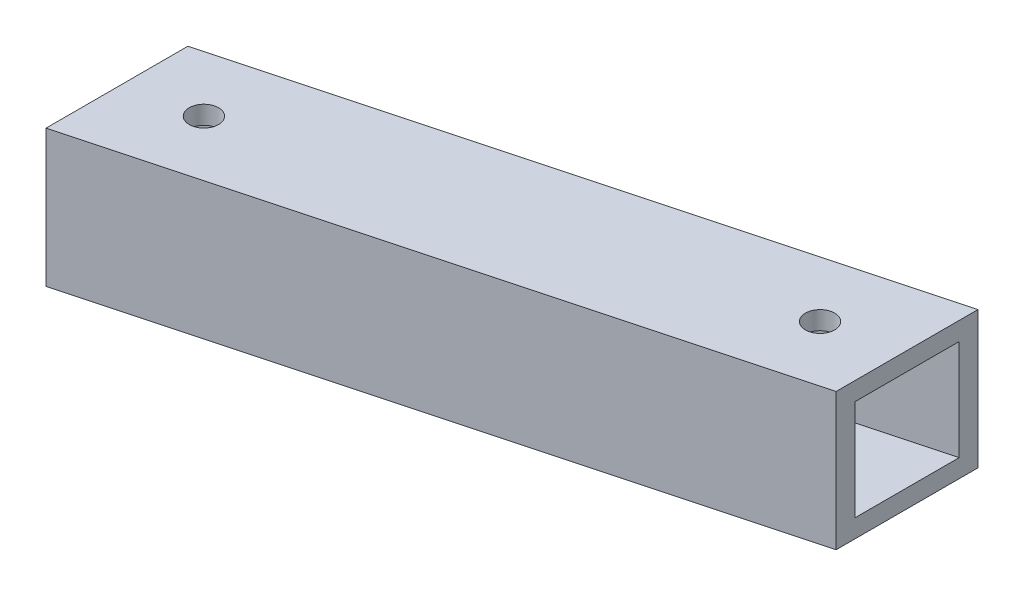
ISO-10303-21;
HEADER;
FILE_DESCRIPTION(('STEP AP214'),'2;1');
FILE_NAME('part.step','',(''),(''),'','','');
FILE_SCHEMA(('AUTOMOTIVE_DESIGN { 1 0 10303 214 1 1 1 1 }'));
ENDSEC;
DATA;
#1=APPLICATION_CONTEXT('core data for automotive mechanical design processes');
#2=APPLICATION_PROTOCOL_DEFINITION('international standard','automotive_design',2000,#1);
#3=PRODUCT_CONTEXT('',#1,'mechanical');
#4=PRODUCT('Part','Part','',(#3));
#5=PRODUCT_RELATED_PRODUCT_CATEGORY('part','',(#4));
#6=PRODUCT_DEFINITION_FORMATION('','',#4);
#7=PRODUCT_DEFINITION_CONTEXT('part definition',#1,'design');
#8=PRODUCT_DEFINITION('design','',#6,#7);
#9=PRODUCT_DEFINITION_SHAPE('','',#8);
#10=(LENGTH_UNIT() NAMED_UNIT(*) SI_UNIT(.MILLI.,.METRE.));
#11=(NAMED_UNIT(*) PLANE_ANGLE_UNIT() SI_UNIT($,.RADIAN.));
#12=(NAMED_UNIT(*) SI_UNIT($,.STERADIAN.) SOLID_ANGLE_UNIT());
#13=UNCERTAINTY_MEASURE_WITH_UNIT(LENGTH_MEASURE(1.E-05),#10,'distance_accuracy_value','');
#14=(GEOMETRIC_REPRESENTATION_CONTEXT(3) GLOBAL_UNCERTAINTY_ASSIGNED_CONTEXT((#13)) GLOBAL_UNIT_ASSIGNED_CONTEXT((#10,
#11,#12)) REPRESENTATION_CONTEXT('',''));
#15=CARTESIAN_POINT('',(0.,0.,0.));
#16=DIRECTION('',(0.,0.,1.));
#17=DIRECTION('',(1.,0.,0.));
#18=AXIS2_PLACEMENT_3D('',#15,#16,#17);
#19=CARTESIAN_POINT('',(130.257574262251,13.,-32.8318594707867));
#20=DIRECTION('',(0.,-1.,0.));
#21=DIRECTION('',(0.,0.,-1.));
#22=AXIS2_PLACEMENT_3D('',#19,#20,#21);
#23=PLANE('',#22);
#24=CARTESIAN_POINT('',(118.617714323462,13.,-24.0189494079213));
#25=DIRECTION('',(0.,-1.,0.));
#26=DIRECTION('',(0.,0.,-1.));
#27=AXIS2_PLACEMENT_3D('',#24,#25,#26);
#28=CIRCLE('',#27,1.6);
#29=CARTESIAN_POINT('',(118.617714323462,13.,-25.6189494079213));
#30=VERTEX_POINT('',#29);
#31=EDGE_CURVE('E182',#30,#30,#28,.T.);
#32=ORIENTED_EDGE('',*,*,#31,.F.);
#33=EDGE_LOOP('',(#32));
#34=FACE_BOUND('',#33,.T.);
#35=CARTESIAN_POINT('',(65.4555495773448,13.,-9.77419029630902));
#36=DIRECTION('',(0.,-1.,0.));
#37=DIRECTION('',(0.,0.,-1.));
#38=AXIS2_PLACEMENT_3D('',#35,#36,#37);
#39=CIRCLE('',#38,1.6);
#40=CARTESIAN_POINT('',(65.4555495773448,13.,-11.374190296309));
#41=VERTEX_POINT('',#40);
#42=EDGE_CURVE('E259',#41,#41,#39,.T.);
#43=ORIENTED_EDGE('',*,*,#42,.F.);
#44=EDGE_LOOP('',(#43));
#45=FACE_BOUND('',#44,.T.);
#46=DIRECTION('',(0.,0.,-1.));
#47=VECTOR('',#46,1.);
#48=CARTESIAN_POINT('',(126.117714323462,13.,-32.8318594707867));
#49=LINE('',#48,#47);
#50=CARTESIAN_POINT('',(126.117714323462,13.,-20.3345493588993));
#51=VERTEX_POINT('',#50);
#52=CARTESIAN_POINT('',(126.117714323462,13.,-31.7225873434102));
#53=VERTEX_POINT('',#52);
#54=EDGE_CURVE('E11',#51,#53,#49,.T.);
#55=ORIENTED_EDGE('',*,*,#54,.F.);
#56=DIRECTION('',(-0.965925826289069,0.,0.258819045102518));
#57=VECTOR('',#56,1.);
#58=CARTESIAN_POINT('',(133.104583758379,13.,-22.2066753816069));
#59=LINE('',#58,#57);
#60=CARTESIAN_POINT('',(57.9555495773448,13.,-2.07055236082013));
#61=VERTEX_POINT('',#60);
#62=EDGE_CURVE('E155',#51,#61,#59,.T.);
#63=ORIENTED_EDGE('',*,*,#62,.T.);
#64=DIRECTION('',(0.,0.,1.));
#65=VECTOR('',#64,1.);
#66=CARTESIAN_POINT('',(57.9555495773448,13.,-32.8318594707867));
#67=LINE('',#66,#65);
#68=CARTESIAN_POINT('',(57.9555495773448,13.,-13.4585903453311));
#69=VERTEX_POINT('',#68);
#70=EDGE_CURVE('E53',#69,#61,#67,.T.);
#71=ORIENTED_EDGE('',*,*,#70,.F.);
#72=DIRECTION('',(-0.965925826289069,0.,0.258819045102518));
#73=VECTOR('',#72,1.);
#74=CARTESIAN_POINT('',(130.257574262251,13.,-32.8318594707867));
#75=LINE('',#74,#73);
#76=EDGE_CURVE('E161',#53,#69,#75,.T.);
#77=ORIENTED_EDGE('',*,*,#76,.F.);
#78=EDGE_LOOP('',(#55,#63,#71,#77));
#79=FACE_BOUND('',#78,.T.);
#80=ADVANCED_FACE('F45',(#34,#45,#79),#23,.T.);
#81=CARTESIAN_POINT('',(130.257574262251,2.,-32.8318594707867));
#82=DIRECTION('',(0.258819045102518,0.,0.965925826289069));
#83=DIRECTION('',(0.965925826289069,0.,-0.258819045102518));
#84=AXIS2_PLACEMENT_3D('',#81,#82,#83);
#85=PLANE('',#84);
#86=DIRECTION('',(0.,-1.,0.));
#87=VECTOR('',#86,1.);
#88=CARTESIAN_POINT('',(126.117714323462,2.,-31.7225873434102));
#89=LINE('',#88,#87);
#90=CARTESIAN_POINT('',(126.117714323462,2.,-31.7225873434102));
#91=VERTEX_POINT('',#90);
#92=EDGE_CURVE('E157',#53,#91,#89,.T.);
#93=ORIENTED_EDGE('',*,*,#92,.F.);
#94=ORIENTED_EDGE('',*,*,#76,.T.);
#95=DIRECTION('',(0.,1.,0.));
#96=VECTOR('',#95,1.);
#97=CARTESIAN_POINT('',(57.9555495773448,2.,-13.4585903453311));
#98=LINE('',#97,#96);
#99=CARTESIAN_POINT('',(57.9555495773448,2.,-13.4585903453311));
#100=VERTEX_POINT('',#99);
#101=EDGE_CURVE('E145',#100,#69,#98,.T.);
#102=ORIENTED_EDGE('',*,*,#101,.F.);
#103=DIRECTION('',(-0.965925826289069,0.,0.258819045102518));
#104=VECTOR('',#103,1.);
#105=CARTESIAN_POINT('',(130.257574262251,2.,-32.8318594707867));
#106=LINE('',#105,#104);
#107=EDGE_CURVE('E164',#91,#100,#106,.T.);
#108=ORIENTED_EDGE('',*,*,#107,.F.);
#109=EDGE_LOOP('',(#93,#94,#102,#108));
#110=FACE_BOUND('',#109,.T.);
#111=ADVANCED_FACE('F194',(#110),#85,.T.);
#112=CARTESIAN_POINT('',(133.104583758379,2.,-22.2066753816069));
#113=DIRECTION('',(0.,1.,0.));
#114=DIRECTION('',(0.,0.,1.));
#115=AXIS2_PLACEMENT_3D('',#112,#113,#114);
#116=PLANE('',#115);
#117=CARTESIAN_POINT('',(118.617714323462,2.,-24.0189494079213));
#118=DIRECTION('',(0.,1.,0.));
#119=DIRECTION('',(0.,0.,1.));
#120=AXIS2_PLACEMENT_3D('',#117,#118,#119);
#121=CIRCLE('',#120,1.6);
#122=CARTESIAN_POINT('',(118.617714323462,2.,-22.4189494079213));
#123=VERTEX_POINT('',#122);
#124=EDGE_CURVE('E272',#123,#123,#121,.T.);
#125=ORIENTED_EDGE('',*,*,#124,.F.);
#126=EDGE_LOOP('',(#125));
#127=FACE_BOUND('',#126,.T.);
#128=CARTESIAN_POINT('',(65.4555495773448,2.,-9.77419029630902));
#129=DIRECTION('',(0.,1.,0.));
#130=DIRECTION('',(0.,0.,1.));
#131=AXIS2_PLACEMENT_3D('',#128,#129,#130);
#132=CIRCLE('',#131,1.6);
#133=CARTESIAN_POINT('',(65.4555495773448,2.,-8.17419029630901));
#134=VERTEX_POINT('',#133);
#135=EDGE_CURVE('E255',#134,#134,#132,.T.);
#136=ORIENTED_EDGE('',*,*,#135,.F.);
#137=EDGE_LOOP('',(#136));
#138=FACE_BOUND('',#137,.T.);
#139=DIRECTION('',(0.,0.,1.));
#140=VECTOR('',#139,1.);
#141=CARTESIAN_POINT('',(126.117714323462,2.,-22.2066753816069));
#142=LINE('',#141,#140);
#143=CARTESIAN_POINT('',(126.117714323462,2.,-20.3345493588993));
#144=VERTEX_POINT('',#143);
#145=EDGE_CURVE('E166',#91,#144,#142,.T.);
#146=ORIENTED_EDGE('',*,*,#145,.F.);
#147=ORIENTED_EDGE('',*,*,#107,.T.);
#148=DIRECTION('',(0.,0.,-1.));
#149=VECTOR('',#148,1.);
#150=CARTESIAN_POINT('',(57.9555495773448,2.,-22.2066753816069));
#151=LINE('',#150,#149);
#152=CARTESIAN_POINT('',(57.9555495773448,2.,-2.07055236082013));
#153=VERTEX_POINT('',#152);
#154=EDGE_CURVE('E158',#153,#100,#151,.T.);
#155=ORIENTED_EDGE('',*,*,#154,.F.);
#156=DIRECTION('',(-0.965925826289069,0.,0.258819045102518));
#157=VECTOR('',#156,1.);
#158=CARTESIAN_POINT('',(133.104583758379,2.,-22.2066753816069));
#159=LINE('',#158,#157);
#160=EDGE_CURVE('E133',#144,#153,#159,.T.);
#161=ORIENTED_EDGE('',*,*,#160,.F.);
#162=EDGE_LOOP('',(#146,#147,#155,#161));
#163=FACE_BOUND('',#162,.T.);
#164=ADVANCED_FACE('F192',(#127,#138,#163),#116,.T.);
#165=CARTESIAN_POINT('',(133.104583758379,13.,-22.2066753816069));
#166=DIRECTION('',(-0.258819045102518,0.,-0.965925826289069));
#167=DIRECTION('',(-0.965925826289069,0.,0.258819045102518));
#168=AXIS2_PLACEMENT_3D('',#165,#166,#167);
#169=PLANE('',#168);
#170=DIRECTION('',(0.,1.,0.));
#171=VECTOR('',#170,1.);
#172=CARTESIAN_POINT('',(126.117714323462,13.,-20.3345493588993));
#173=LINE('',#172,#171);
#174=EDGE_CURVE('E162',#144,#51,#173,.T.);
#175=ORIENTED_EDGE('',*,*,#174,.F.);
#176=ORIENTED_EDGE('',*,*,#160,.T.);
#177=DIRECTION('',(0.,-1.,0.));
#178=VECTOR('',#177,1.);
#179=CARTESIAN_POINT('',(57.9555495773448,13.,-2.07055236082013));
#180=LINE('',#179,#178);
#181=EDGE_CURVE('E142',#61,#153,#180,.T.);
#182=ORIENTED_EDGE('',*,*,#181,.F.);
#183=ORIENTED_EDGE('',*,*,#62,.F.);
#184=EDGE_LOOP('',(#175,#176,#182,#183));
#185=FACE_BOUND('',#184,.T.);
#186=ADVANCED_FACE('F154',(#185),#169,.T.);
#187=CARTESIAN_POINT('',(57.9555495773448,0.,-15.5291427061512));
#188=DIRECTION('',(1.,0.,0.));
#189=DIRECTION('',(0.,0.,-1.));
#190=AXIS2_PLACEMENT_3D('',#187,#188,#189);
#191=PLANE('',#190);
#192=ORIENTED_EDGE('',*,*,#181,.T.);
#193=ORIENTED_EDGE('',*,*,#154,.T.);
#194=ORIENTED_EDGE('',*,*,#101,.T.);
#195=ORIENTED_EDGE('',*,*,#70,.T.);
#196=EDGE_LOOP('',(#192,#193,#194,#195));
#197=FACE_BOUND('',#196,.T.);
#198=DIRECTION('',(0.,0.,-1.));
#199=VECTOR('',#198,1.);
#200=CARTESIAN_POINT('',(57.9555495773448,15.,-15.5291427061512));
#201=LINE('',#200,#199);
#202=CARTESIAN_POINT('',(57.9555495773448,15.,0.));
#203=VERTEX_POINT('',#202);
#204=CARTESIAN_POINT('',(57.9555495773448,15.,-15.5291427061512));
#205=VERTEX_POINT('',#204);
#206=EDGE_CURVE('E176',#203,#205,#201,.T.);
#207=ORIENTED_EDGE('',*,*,#206,.T.);
#208=DIRECTION('',(0.,1.,0.));
#209=VECTOR('',#208,1.);
#210=CARTESIAN_POINT('',(57.9555495773448,0.,-15.5291427061512));
#211=LINE('',#210,#209);
#212=CARTESIAN_POINT('',(57.9555495773448,0.,-15.5291427061512));
#213=VERTEX_POINT('',#212);
#214=EDGE_CURVE('E60',#213,#205,#211,.T.);
#215=ORIENTED_EDGE('',*,*,#214,.F.);
#216=DIRECTION('',(0.,0.,-1.));
#217=VECTOR('',#216,1.);
#218=CARTESIAN_POINT('',(57.9555495773448,0.,-15.5291427061512));
#219=LINE('',#218,#217);
#220=CARTESIAN_POINT('',(57.9555495773448,0.,0.));
#221=VERTEX_POINT('',#220);
#222=EDGE_CURVE('E127',#221,#213,#219,.T.);
#223=ORIENTED_EDGE('',*,*,#222,.F.);
#224=DIRECTION('',(0.,-1.,0.));
#225=VECTOR('',#224,1.);
#226=CARTESIAN_POINT('',(57.9555495773448,15.,0.));
#227=LINE('',#226,#225);
#228=EDGE_CURVE('E124',#203,#221,#227,.T.);
#229=ORIENTED_EDGE('',*,*,#228,.F.);
#230=EDGE_LOOP('',(#207,#215,#223,#229));
#231=FACE_BOUND('',#230,.T.);
#232=ADVANCED_FACE('F141',(#197,#231),#191,.F.);
#233=CARTESIAN_POINT('',(126.117714323462,0.,-33.7931397042304));
#234=DIRECTION('',(-1.,0.,0.));
#235=DIRECTION('',(0.,0.,1.));
#236=AXIS2_PLACEMENT_3D('',#233,#234,#235);
#237=PLANE('',#236);
#238=ORIENTED_EDGE('',*,*,#174,.T.);
#239=ORIENTED_EDGE('',*,*,#54,.T.);
#240=ORIENTED_EDGE('',*,*,#92,.T.);
#241=ORIENTED_EDGE('',*,*,#145,.T.);
#242=EDGE_LOOP('',(#238,#239,#240,#241));
#243=FACE_BOUND('',#242,.T.);
#244=DIRECTION('',(0.,0.,1.));
#245=VECTOR('',#244,1.);
#246=CARTESIAN_POINT('',(126.117714323462,15.,-33.7931397042304));
#247=LINE('',#246,#245);
#248=CARTESIAN_POINT('',(126.117714323462,15.,-33.7931397042304));
#249=VERTEX_POINT('',#248);
#250=CARTESIAN_POINT('',(126.117714323462,15.,-18.2639969980791));
#251=VERTEX_POINT('',#250);
#252=EDGE_CURVE('E115',#249,#251,#247,.T.);
#253=ORIENTED_EDGE('',*,*,#252,.T.);
#254=DIRECTION('',(0.,1.,0.));
#255=VECTOR('',#254,1.);
#256=CARTESIAN_POINT('',(126.117714323462,0.,-18.2639969980791));
#257=LINE('',#256,#255);
#258=CARTESIAN_POINT('',(126.117714323462,0.,-18.2639969980791));
#259=VERTEX_POINT('',#258);
#260=EDGE_CURVE('E68',#259,#251,#257,.T.);
#261=ORIENTED_EDGE('',*,*,#260,.F.);
#262=DIRECTION('',(0.,0.,1.));
#263=VECTOR('',#262,1.);
#264=CARTESIAN_POINT('',(126.117714323462,0.,-33.7931397042304));
#265=LINE('',#264,#263);
#266=CARTESIAN_POINT('',(126.117714323462,0.,-33.7931397042304));
#267=VERTEX_POINT('',#266);
#268=EDGE_CURVE('E106',#267,#259,#265,.T.);
#269=ORIENTED_EDGE('',*,*,#268,.F.);
#270=DIRECTION('',(0.,-1.,0.));
#271=VECTOR('',#270,1.);
#272=CARTESIAN_POINT('',(126.117714323462,15.,-33.7931397042304));
#273=LINE('',#272,#271);
#274=EDGE_CURVE('E109',#249,#267,#273,.T.);
#275=ORIENTED_EDGE('',*,*,#274,.F.);
#276=EDGE_LOOP('',(#253,#261,#269,#275));
#277=FACE_BOUND('',#276,.T.);
#278=ADVANCED_FACE('F108',(#243,#277),#237,.F.);
#279=CARTESIAN_POINT('',(3.88228567653777,15.,14.488887394336));
#280=DIRECTION('',(0.258819045102518,0.,0.965925826289069));
#281=DIRECTION('',(0.965925826289069,0.,-0.258819045102518));
#282=AXIS2_PLACEMENT_3D('',#279,#280,#281);
#283=PLANE('',#282);
#284=ORIENTED_EDGE('',*,*,#260,.T.);
#285=DIRECTION('',(-0.965925826289069,0.,0.258819045102518));
#286=VECTOR('',#285,1.);
#287=CARTESIAN_POINT('',(3.88228567653777,15.,14.488887394336));
#288=LINE('',#287,#286);
#289=EDGE_CURVE('E128',#251,#203,#288,.T.);
#290=ORIENTED_EDGE('',*,*,#289,.T.);
#291=ORIENTED_EDGE('',*,*,#228,.T.);
#292=DIRECTION('',(-0.965925826289069,0.,0.258819045102518));
#293=VECTOR('',#292,1.);
#294=CARTESIAN_POINT('',(3.88228567653777,0.,14.488887394336));
#295=LINE('',#294,#293);
#296=EDGE_CURVE('E129',#259,#221,#295,.T.);
#297=ORIENTED_EDGE('',*,*,#296,.F.);
#298=EDGE_LOOP('',(#284,#290,#291,#297));
#299=FACE_BOUND('',#298,.T.);
#300=ADVANCED_FACE('F47',(#299),#283,.T.);
#301=CARTESIAN_POINT('',(0.,15.,0.));
#302=DIRECTION('',(0.258819045102518,0.,0.965925826289069));
#303=DIRECTION('',(0.965925826289069,0.,-0.258819045102518));
#304=AXIS2_PLACEMENT_3D('',#301,#302,#303);
#305=PLANE('',#304);
#306=DIRECTION('',(-0.965925826289069,0.,0.258819045102518));
#307=VECTOR('',#306,1.);
#308=CARTESIAN_POINT('',(0.,0.,0.));
#309=LINE('',#308,#307);
#310=EDGE_CURVE('E121',#267,#213,#309,.T.);
#311=ORIENTED_EDGE('',*,*,#310,.T.);
#312=ORIENTED_EDGE('',*,*,#214,.T.);
#313=DIRECTION('',(-0.965925826289069,0.,0.258819045102518));
#314=VECTOR('',#313,1.);
#315=CARTESIAN_POINT('',(0.,15.,0.));
#316=LINE('',#315,#314);
#317=EDGE_CURVE('E123',#249,#205,#316,.T.);
#318=ORIENTED_EDGE('',*,*,#317,.F.);
#319=ORIENTED_EDGE('',*,*,#274,.T.);
#320=EDGE_LOOP('',(#311,#312,#318,#319));
#321=FACE_BOUND('',#320,.T.);
#322=ADVANCED_FACE('F120',(#321),#305,.F.);
#323=CARTESIAN_POINT('',(0.,15.,0.));
#324=DIRECTION('',(0.,1.,0.));
#325=DIRECTION('',(0.,0.,1.));
#326=AXIS2_PLACEMENT_3D('',#323,#324,#325);
#327=PLANE('',#326);
#328=CARTESIAN_POINT('',(118.617714323462,15.,-24.0189494079213));
#329=DIRECTION('',(0.,-1.,0.));
#330=DIRECTION('',(0.,0.,-1.));
#331=AXIS2_PLACEMENT_3D('',#328,#329,#330);
#332=CIRCLE('',#331,1.6);
#333=CARTESIAN_POINT('',(118.617714323462,15.,-25.6189494079213));
#334=VERTEX_POINT('',#333);
#335=EDGE_CURVE('E254',#334,#334,#332,.T.);
#336=ORIENTED_EDGE('',*,*,#335,.T.);
#337=EDGE_LOOP('',(#336));
#338=FACE_BOUND('',#337,.T.);
#339=CARTESIAN_POINT('',(65.4555495773448,15.,-9.77419029630902));
#340=DIRECTION('',(0.,-1.,0.));
#341=DIRECTION('',(0.,0.,-1.));
#342=AXIS2_PLACEMENT_3D('',#339,#340,#341);
#343=CIRCLE('',#342,1.6);
#344=CARTESIAN_POINT('',(65.4555495773448,15.,-11.374190296309));
#345=VERTEX_POINT('',#344);
#346=EDGE_CURVE('E267',#345,#345,#343,.T.);
#347=ORIENTED_EDGE('',*,*,#346,.T.);
#348=EDGE_LOOP('',(#347));
#349=FACE_BOUND('',#348,.T.);
#350=ORIENTED_EDGE('',*,*,#252,.F.);
#351=ORIENTED_EDGE('',*,*,#317,.T.);
#352=ORIENTED_EDGE('',*,*,#206,.F.);
#353=ORIENTED_EDGE('',*,*,#289,.F.);
#354=EDGE_LOOP('',(#350,#351,#352,#353));
#355=FACE_BOUND('',#354,.T.);
#356=ADVANCED_FACE('F174',(#338,#349,#355),#327,.T.);
#357=CARTESIAN_POINT('',(0.,0.,0.));
#358=DIRECTION('',(0.,1.,0.));
#359=DIRECTION('',(0.,0.,1.));
#360=AXIS2_PLACEMENT_3D('',#357,#358,#359);
#361=PLANE('',#360);
#362=CARTESIAN_POINT('',(118.617714323462,0.,-24.0189494079213));
#363=DIRECTION('',(0.,-1.,0.));
#364=DIRECTION('',(0.,0.,-1.));
#365=AXIS2_PLACEMENT_3D('',#362,#363,#364);
#366=CIRCLE('',#365,1.6);
#367=CARTESIAN_POINT('',(118.617714323462,0.,-25.6189494079213));
#368=VERTEX_POINT('',#367);
#369=EDGE_CURVE('E256',#368,#368,#366,.T.);
#370=ORIENTED_EDGE('',*,*,#369,.F.);
#371=EDGE_LOOP('',(#370));
#372=FACE_BOUND('',#371,.T.);
#373=CARTESIAN_POINT('',(65.4555495773448,0.,-9.77419029630902));
#374=DIRECTION('',(0.,-1.,0.));
#375=DIRECTION('',(0.,0.,-1.));
#376=AXIS2_PLACEMENT_3D('',#373,#374,#375);
#377=CIRCLE('',#376,1.6);
#378=CARTESIAN_POINT('',(65.4555495773448,0.,-11.374190296309));
#379=VERTEX_POINT('',#378);
#380=EDGE_CURVE('E262',#379,#379,#377,.T.);
#381=ORIENTED_EDGE('',*,*,#380,.F.);
#382=EDGE_LOOP('',(#381));
#383=FACE_BOUND('',#382,.T.);
#384=ORIENTED_EDGE('',*,*,#310,.F.);
#385=ORIENTED_EDGE('',*,*,#268,.T.);
#386=ORIENTED_EDGE('',*,*,#296,.T.);
#387=ORIENTED_EDGE('',*,*,#222,.T.);
#388=EDGE_LOOP('',(#384,#385,#386,#387));
#389=FACE_BOUND('',#388,.T.);
#390=ADVANCED_FACE('F126',(#372,#383,#389),#361,.F.);
#391=CARTESIAN_POINT('',(65.4555495773448,15.,-9.77419029630902));
#392=DIRECTION('',(0.,-1.,0.));
#393=DIRECTION('',(0.,0.,-1.));
#394=AXIS2_PLACEMENT_3D('',#391,#392,#393);
#395=CYLINDRICAL_SURFACE('',#394,1.6);
#396=ORIENTED_EDGE('',*,*,#135,.T.);
#397=EDGE_LOOP('',(#396));
#398=FACE_BOUND('',#397,.T.);
#399=ORIENTED_EDGE('',*,*,#380,.T.);
#400=EDGE_LOOP('',(#399));
#401=FACE_BOUND('',#400,.T.);
#402=ADVANCED_FACE('F215',(#398,#401),#395,.F.);
#403=CARTESIAN_POINT('',(118.617714323462,15.,-24.0189494079213));
#404=DIRECTION('',(0.,-1.,0.));
#405=DIRECTION('',(0.,0.,-1.));
#406=AXIS2_PLACEMENT_3D('',#403,#404,#405);
#407=CYLINDRICAL_SURFACE('',#406,1.6);
#408=ORIENTED_EDGE('',*,*,#124,.T.);
#409=EDGE_LOOP('',(#408));
#410=FACE_BOUND('',#409,.T.);
#411=ORIENTED_EDGE('',*,*,#369,.T.);
#412=EDGE_LOOP('',(#411));
#413=FACE_BOUND('',#412,.T.);
#414=ADVANCED_FACE('F233',(#410,#413),#407,.F.);
#415=ORIENTED_EDGE('',*,*,#42,.T.);
#416=EDGE_LOOP('',(#415));
#417=FACE_BOUND('',#416,.T.);
#418=ORIENTED_EDGE('',*,*,#346,.F.);
#419=EDGE_LOOP('',(#418));
#420=FACE_BOUND('',#419,.T.);
#421=ADVANCED_FACE('F235',(#417,#420),#395,.F.);
#422=ORIENTED_EDGE('',*,*,#31,.T.);
#423=EDGE_LOOP('',(#422));
#424=FACE_BOUND('',#423,.T.);
#425=ORIENTED_EDGE('',*,*,#335,.F.);
#426=EDGE_LOOP('',(#425));
#427=FACE_BOUND('',#426,.T.);
#428=ADVANCED_FACE('F238',(#424,#427),#407,.F.);
#429=CLOSED_SHELL('',(#80,#111,#164,#186,#232,#278,#300,#322,#356,#390,#402,#414,#421,#428));
#430=MANIFOLD_SOLID_BREP('B2',#429);
#431=ADVANCED_BREP_SHAPE_REPRESENTATION('',(#18,#430),#14);
#432=SHAPE_DEFINITION_REPRESENTATION(#9,#431);
ENDSEC;
END-ISO-10303-21;
